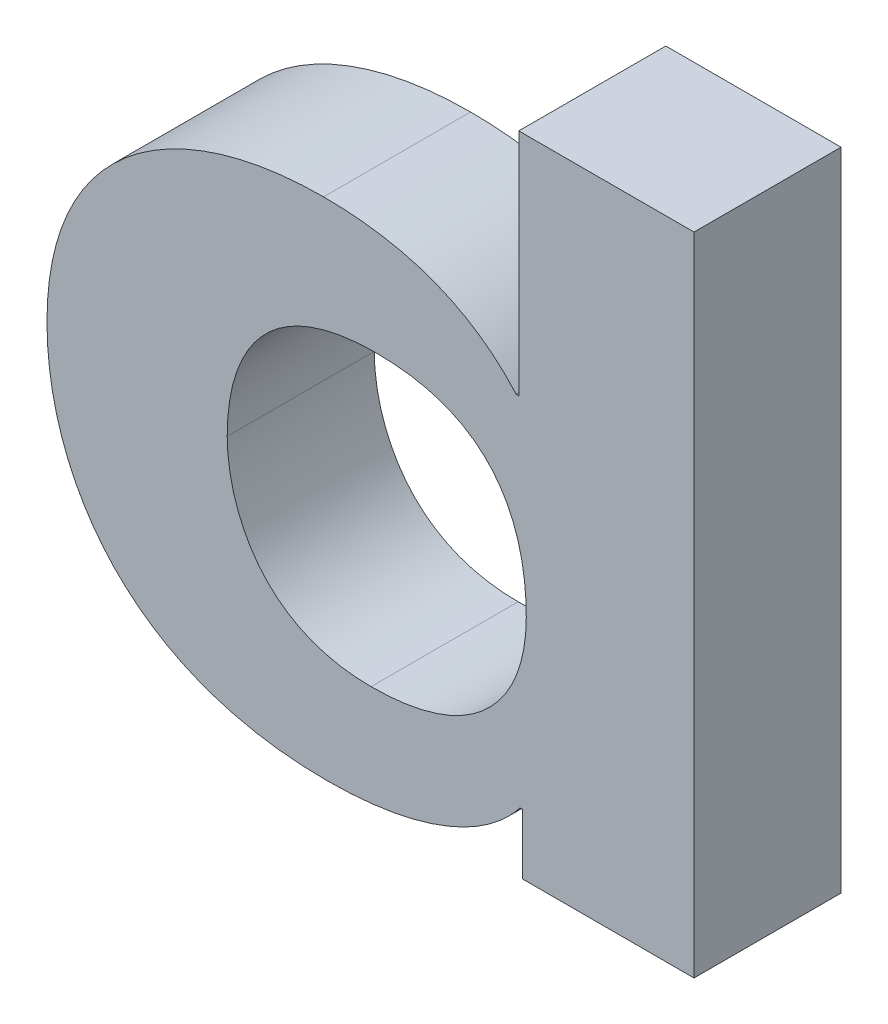
ISO-10303-21;
HEADER;
FILE_DESCRIPTION(('STEP AP214'),'2;1');
FILE_NAME('part.step','',(''),(''),'','','');
FILE_SCHEMA(('AUTOMOTIVE_DESIGN { 1 0 10303 214 1 1 1 1 }'));
ENDSEC;
DATA;
#1=APPLICATION_CONTEXT('core data for automotive mechanical design processes');
#2=APPLICATION_PROTOCOL_DEFINITION('international standard','automotive_design',2000,#1);
#3=PRODUCT_CONTEXT('',#1,'mechanical');
#4=PRODUCT('Part','Part','',(#3));
#5=PRODUCT_RELATED_PRODUCT_CATEGORY('part','',(#4));
#6=PRODUCT_DEFINITION_FORMATION('','',#4);
#7=PRODUCT_DEFINITION_CONTEXT('part definition',#1,'design');
#8=PRODUCT_DEFINITION('design','',#6,#7);
#9=PRODUCT_DEFINITION_SHAPE('','',#8);
#10=(LENGTH_UNIT() NAMED_UNIT(*) SI_UNIT(.MILLI.,.METRE.));
#11=(NAMED_UNIT(*) PLANE_ANGLE_UNIT() SI_UNIT($,.RADIAN.));
#12=(NAMED_UNIT(*) SI_UNIT($,.STERADIAN.) SOLID_ANGLE_UNIT());
#13=UNCERTAINTY_MEASURE_WITH_UNIT(LENGTH_MEASURE(1.E-05),#10,'distance_accuracy_value','');
#14=(GEOMETRIC_REPRESENTATION_CONTEXT(3) GLOBAL_UNCERTAINTY_ASSIGNED_CONTEXT((#13)) GLOBAL_UNIT_ASSIGNED_CONTEXT((#10,
#11,#12)) REPRESENTATION_CONTEXT('',''));
#15=CARTESIAN_POINT('',(0.,0.,0.));
#16=DIRECTION('',(0.,0.,1.));
#17=DIRECTION('',(1.,0.,0.));
#18=AXIS2_PLACEMENT_3D('',#15,#16,#17);
#19=CARTESIAN_POINT('',(14.48304104192,-0.146071150301,-5.499));
#20=CARTESIAN_POINT('',(14.48304104192,-0.146071150301,-6.501));
#21=CARTESIAN_POINT('',(15.30018444192,-0.146071150301,-5.499));
#22=CARTESIAN_POINT('',(15.30018444192,-0.146071150301,-6.501));
#23=CARTESIAN_POINT('',(15.50452461969,-0.67247203919,-5.499));
#24=CARTESIAN_POINT('',(15.50452461969,-0.67247203919,-6.501));
#25=CARTESIAN_POINT('',(15.50452461969,-1.192661216968,-5.499));
#26=CARTESIAN_POINT('',(15.50452461969,-1.192661216968,-6.501));
#27=(BOUNDED_SURFACE() B_SPLINE_SURFACE(3,1,((#19,#20),(#21,#22),(#23,#24),(#25,#26)),
.UNSPECIFIED.,.F.,.F.,.F.) B_SPLINE_SURFACE_WITH_KNOTS((4,4),(2,2),(0.,1.),(-1.001,0.001),
.UNSPECIFIED.) GEOMETRIC_REPRESENTATION_ITEM() RATIONAL_B_SPLINE_SURFACE(((1.,1.),(1.,1.),(1.,
1.),(1.,1.))) REPRESENTATION_ITEM('') SURFACE());
#28=DIRECTION('',(0.,0.,1.));
#29=VECTOR('',#28,1.);
#30=CARTESIAN_POINT('',(14.48304104192,-0.146071150301,-6.5));
#31=LINE('',#30,#29);
#32=CARTESIAN_POINT('',(14.48304104192,-0.146071150301,-6.5));
#33=VERTEX_POINT('',#32);
#34=CARTESIAN_POINT('',(14.48304104192,-0.146071150301,-5.5));
#35=VERTEX_POINT('',#34);
#36=EDGE_CURVE('E205',#33,#35,#31,.T.);
#37=CARTESIAN_POINT('',(14.48304104192,-0.146071150301,-6.5));
#38=CARTESIAN_POINT('',(15.30018444192,-0.146071150301,-6.5));
#39=CARTESIAN_POINT('',(15.50452461969,-0.67247203919,-6.5));
#40=CARTESIAN_POINT('',(15.50452461969,-1.192661216968,-6.5));
#41=(BOUNDED_CURVE() B_SPLINE_CURVE(3,(#37,#38,#39,#40),.UNSPECIFIED.,.F.,
.F.) B_SPLINE_CURVE_WITH_KNOTS((4,4),(0.,1.),
.UNSPECIFIED.) CURVE() GEOMETRIC_REPRESENTATION_ITEM() RATIONAL_B_SPLINE_CURVE((1.,1.,1.,1.)) REPRESENTATION_ITEM(''));
#42=CARTESIAN_POINT('',(15.50452461969,-1.192661216968,-6.5));
#43=VERTEX_POINT('',#42);
#44=EDGE_CURVE('E367',#33,#43,#41,.T.);
#45=DIRECTION('',(0.,0.,1.));
#46=VECTOR('',#45,1.);
#47=CARTESIAN_POINT('',(15.50452461969,-1.192661216968,-6.5));
#48=LINE('',#47,#46);
#49=CARTESIAN_POINT('',(15.50452461969,-1.192661216968,-5.5));
#50=VERTEX_POINT('',#49);
#51=EDGE_CURVE('E10',#43,#50,#48,.T.);
#52=CARTESIAN_POINT('',(14.48304104192,-0.146071150301,-5.5));
#53=CARTESIAN_POINT('',(15.30018444192,-0.146071150301,-5.5));
#54=CARTESIAN_POINT('',(15.50452461969,-0.67247203919,-5.5));
#55=CARTESIAN_POINT('',(15.50452461969,-1.192661216968,-5.5));
#56=(BOUNDED_CURVE() B_SPLINE_CURVE(3,(#52,#53,#54,#55),.UNSPECIFIED.,.F.,
.F.) B_SPLINE_CURVE_WITH_KNOTS((4,4),(0.,1.),
.UNSPECIFIED.) CURVE() GEOMETRIC_REPRESENTATION_ITEM() RATIONAL_B_SPLINE_CURVE((1.,1.,1.,1.)) REPRESENTATION_ITEM(''));
#57=EDGE_CURVE('E248',#35,#50,#56,.T.);
#58=ORIENTED_EDGE('',*,*,#36,.F.);
#59=ORIENTED_EDGE('',*,*,#44,.T.);
#60=ORIENTED_EDGE('',*,*,#51,.T.);
#61=ORIENTED_EDGE('',*,*,#57,.F.);
#62=EDGE_LOOP('',(#58,#59,#60,#61));
#63=FACE_BOUND('',#62,.T.);
#64=ADVANCED_FACE('F15',(#63),#27,.F.);
#65=CARTESIAN_POINT('',(15.50452461969,-1.192661216968,-5.499));
#66=CARTESIAN_POINT('',(15.50452461969,-1.192661216968,-6.501));
#67=CARTESIAN_POINT('',(15.50452461969,-1.676390105857,-5.499));
#68=CARTESIAN_POINT('',(15.50452461969,-1.676390105857,-6.501));
#69=CARTESIAN_POINT('',(15.20666164192,-2.12918743919,-5.499));
#70=CARTESIAN_POINT('',(15.20666164192,-2.12918743919,-6.501));
#71=CARTESIAN_POINT('',(14.44897117525,-2.12918743919,-5.499));
#72=CARTESIAN_POINT('',(14.44897117525,-2.12918743919,-6.501));
#73=(BOUNDED_SURFACE() B_SPLINE_SURFACE(3,1,((#65,#66),(#67,#68),(#69,#70),(#71,#72)),
.UNSPECIFIED.,.F.,.F.,.F.) B_SPLINE_SURFACE_WITH_KNOTS((4,4),(2,2),(0.,1.),(-1.001,
0.00100000000000067),
.UNSPECIFIED.) GEOMETRIC_REPRESENTATION_ITEM() RATIONAL_B_SPLINE_SURFACE(((1.,1.),(1.,1.),(1.,
1.),(1.,1.))) REPRESENTATION_ITEM('') SURFACE());
#74=CARTESIAN_POINT('',(15.50452461969,-1.192661216968,-6.5));
#75=CARTESIAN_POINT('',(15.50452461969,-1.676390105857,-6.5));
#76=CARTESIAN_POINT('',(15.20666164192,-2.12918743919,-6.5));
#77=CARTESIAN_POINT('',(14.44897117525,-2.12918743919,-6.5));
#78=(BOUNDED_CURVE() B_SPLINE_CURVE(3,(#74,#75,#76,#77),.UNSPECIFIED.,.F.,
.F.) B_SPLINE_CURVE_WITH_KNOTS((4,4),(0.,1.),
.UNSPECIFIED.) CURVE() GEOMETRIC_REPRESENTATION_ITEM() RATIONAL_B_SPLINE_CURVE((1.,1.,1.,1.)) REPRESENTATION_ITEM(''));
#79=CARTESIAN_POINT('',(14.44897117525,-2.12918743919,-6.5));
#80=VERTEX_POINT('',#79);
#81=EDGE_CURVE('E377',#43,#80,#78,.T.);
#82=DIRECTION('',(0.,0.,1.));
#83=VECTOR('',#82,1.);
#84=CARTESIAN_POINT('',(14.44897117525,-2.12918743919,-6.5));
#85=LINE('',#84,#83);
#86=CARTESIAN_POINT('',(14.44897117525,-2.12918743919,-5.5));
#87=VERTEX_POINT('',#86);
#88=EDGE_CURVE('E30',#80,#87,#85,.T.);
#89=CARTESIAN_POINT('',(15.50452461969,-1.192661216968,-5.5));
#90=CARTESIAN_POINT('',(15.50452461969,-1.676390105857,-5.5));
#91=CARTESIAN_POINT('',(15.20666164192,-2.12918743919,-5.5));
#92=CARTESIAN_POINT('',(14.44897117525,-2.12918743919,-5.5));
#93=(BOUNDED_CURVE() B_SPLINE_CURVE(3,(#89,#90,#91,#92),.UNSPECIFIED.,.F.,
.F.) B_SPLINE_CURVE_WITH_KNOTS((4,4),(0.,1.),
.UNSPECIFIED.) CURVE() GEOMETRIC_REPRESENTATION_ITEM() RATIONAL_B_SPLINE_CURVE((1.,1.,1.,1.)) REPRESENTATION_ITEM(''));
#94=EDGE_CURVE('E272',#50,#87,#93,.T.);
#95=ORIENTED_EDGE('',*,*,#51,.F.);
#96=ORIENTED_EDGE('',*,*,#81,.T.);
#97=ORIENTED_EDGE('',*,*,#88,.T.);
#98=ORIENTED_EDGE('',*,*,#94,.F.);
#99=EDGE_LOOP('',(#95,#96,#97,#98));
#100=FACE_BOUND('',#99,.T.);
#101=ADVANCED_FACE('F416',(#100),#73,.F.);
#102=CARTESIAN_POINT('',(14.44897117525,-2.12918743919,-5.499));
#103=CARTESIAN_POINT('',(14.44897117525,-2.12918743919,-6.501));
#104=CARTESIAN_POINT('',(13.68291846414,-2.12918743919,-5.499));
#105=CARTESIAN_POINT('',(13.68291846414,-2.12918743919,-6.501));
#106=CARTESIAN_POINT('',(13.47004106414,-1.529349505857,-5.499));
#107=CARTESIAN_POINT('',(13.47004106414,-1.529349505857,-6.501));
#108=CARTESIAN_POINT('',(13.47004106414,-1.143701305857,-5.499));
#109=CARTESIAN_POINT('',(13.47004106414,-1.143701305857,-6.501));
#110=(BOUNDED_SURFACE() B_SPLINE_SURFACE(3,1,((#102,#103),(#104,#105),(#106,#107),(#108,#109)),
.UNSPECIFIED.,.F.,.F.,.F.) B_SPLINE_SURFACE_WITH_KNOTS((4,4),(2,2),(0.,1.),(-1.001,0.001),
.UNSPECIFIED.) GEOMETRIC_REPRESENTATION_ITEM() RATIONAL_B_SPLINE_SURFACE(((1.,1.),(1.,1.),(1.,
1.),(1.,1.))) REPRESENTATION_ITEM('') SURFACE());
#111=CARTESIAN_POINT('',(14.44897117525,-2.12918743919,-6.5));
#112=CARTESIAN_POINT('',(13.68291846414,-2.12918743919,-6.5));
#113=CARTESIAN_POINT('',(13.47004106414,-1.529349505857,-6.5));
#114=CARTESIAN_POINT('',(13.47004106414,-1.143701305857,-6.5));
#115=(BOUNDED_CURVE() B_SPLINE_CURVE(3,(#111,#112,#113,#114),.UNSPECIFIED.,.F.,
.F.) B_SPLINE_CURVE_WITH_KNOTS((4,4),(0.,1.),
.UNSPECIFIED.) CURVE() GEOMETRIC_REPRESENTATION_ITEM() RATIONAL_B_SPLINE_CURVE((1.,1.,1.,1.)) REPRESENTATION_ITEM(''));
#116=CARTESIAN_POINT('',(13.47004106414,-1.143701305857,-6.5));
#117=VERTEX_POINT('',#116);
#118=EDGE_CURVE('E315',#80,#117,#115,.T.);
#119=DIRECTION('',(0.,0.,1.));
#120=VECTOR('',#119,1.);
#121=CARTESIAN_POINT('',(13.47004106414,-1.143701305857,-6.5));
#122=LINE('',#121,#120);
#123=CARTESIAN_POINT('',(13.47004106414,-1.143701305857,-5.5));
#124=VERTEX_POINT('',#123);
#125=EDGE_CURVE('E208',#117,#124,#122,.T.);
#126=CARTESIAN_POINT('',(14.44897117525,-2.12918743919,-5.5));
#127=CARTESIAN_POINT('',(13.68291846414,-2.12918743919,-5.5));
#128=CARTESIAN_POINT('',(13.47004106414,-1.529349505857,-5.5));
#129=CARTESIAN_POINT('',(13.47004106414,-1.143701305857,-5.5));
#130=(BOUNDED_CURVE() B_SPLINE_CURVE(3,(#126,#127,#128,#129),.UNSPECIFIED.,.F.,
.F.) B_SPLINE_CURVE_WITH_KNOTS((4,4),(0.,1.),
.UNSPECIFIED.) CURVE() GEOMETRIC_REPRESENTATION_ITEM() RATIONAL_B_SPLINE_CURVE((1.,1.,1.,1.)) REPRESENTATION_ITEM(''));
#131=EDGE_CURVE('E256',#87,#124,#130,.T.);
#132=ORIENTED_EDGE('',*,*,#88,.F.);
#133=ORIENTED_EDGE('',*,*,#118,.T.);
#134=ORIENTED_EDGE('',*,*,#125,.T.);
#135=ORIENTED_EDGE('',*,*,#131,.F.);
#136=EDGE_LOOP('',(#132,#133,#134,#135));
#137=FACE_BOUND('',#136,.T.);
#138=ADVANCED_FACE('F422',(#137),#110,.F.);
#139=CARTESIAN_POINT('',(13.47004106414,-1.143701305857,-5.499));
#140=CARTESIAN_POINT('',(13.47004106414,-1.143701305857,-6.501));
#141=CARTESIAN_POINT('',(13.47003824192,-0.629438794746,-5.499));
#142=CARTESIAN_POINT('',(13.47003824192,-0.629438794746,-6.501));
#143=CARTESIAN_POINT('',(13.72540419747,-0.146071150301,-5.499));
#144=CARTESIAN_POINT('',(13.72540419747,-0.146071150301,-6.501));
#145=CARTESIAN_POINT('',(14.48304104192,-0.146071150301,-5.499));
#146=CARTESIAN_POINT('',(14.48304104192,-0.146071150301,-6.501));
#147=(BOUNDED_SURFACE() B_SPLINE_SURFACE(3,1,((#139,#140),(#141,#142),(#143,#144),(#145,#146)),
.UNSPECIFIED.,.F.,.F.,.F.) B_SPLINE_SURFACE_WITH_KNOTS((4,4),(2,2),(0.,1.),(-1.001,0.001),
.UNSPECIFIED.) GEOMETRIC_REPRESENTATION_ITEM() RATIONAL_B_SPLINE_SURFACE(((1.,1.),(1.,1.),(1.,
1.),(1.,1.))) REPRESENTATION_ITEM('') SURFACE());
#148=CARTESIAN_POINT('',(13.47004106414,-1.143701305857,-6.5));
#149=CARTESIAN_POINT('',(13.47003824192,-0.629438794746,-6.5));
#150=CARTESIAN_POINT('',(13.72540419747,-0.146071150301,-6.5));
#151=CARTESIAN_POINT('',(14.48304104192,-0.146071150301,-6.5));
#152=(BOUNDED_CURVE() B_SPLINE_CURVE(3,(#148,#149,#150,#151),.UNSPECIFIED.,.F.,
.F.) B_SPLINE_CURVE_WITH_KNOTS((4,4),(0.,1.),
.UNSPECIFIED.) CURVE() GEOMETRIC_REPRESENTATION_ITEM() RATIONAL_B_SPLINE_CURVE((1.,1.,1.,1.)) REPRESENTATION_ITEM(''));
#153=EDGE_CURVE('E218',#117,#33,#152,.T.);
#154=CARTESIAN_POINT('',(13.47004106414,-1.143701305857,-5.5));
#155=CARTESIAN_POINT('',(13.47003824192,-0.629438794746,-5.5));
#156=CARTESIAN_POINT('',(13.72540419747,-0.146071150301,-5.5));
#157=CARTESIAN_POINT('',(14.48304104192,-0.146071150301,-5.5));
#158=(BOUNDED_CURVE() B_SPLINE_CURVE(3,(#154,#155,#156,#157),.UNSPECIFIED.,.F.,
.F.) B_SPLINE_CURVE_WITH_KNOTS((4,4),(0.,1.),
.UNSPECIFIED.) CURVE() GEOMETRIC_REPRESENTATION_ITEM() RATIONAL_B_SPLINE_CURVE((1.,1.,1.,1.)) REPRESENTATION_ITEM(''));
#159=EDGE_CURVE('E240',#124,#35,#158,.T.);
#160=ORIENTED_EDGE('',*,*,#125,.F.);
#161=ORIENTED_EDGE('',*,*,#153,.T.);
#162=ORIENTED_EDGE('',*,*,#36,.T.);
#163=ORIENTED_EDGE('',*,*,#159,.F.);
#164=EDGE_LOOP('',(#160,#161,#162,#163));
#165=FACE_BOUND('',#164,.T.);
#166=ADVANCED_FACE('F439',(#165),#147,.F.);
#167=CARTESIAN_POINT('',(15.47052248636,-2.337185216968,-5.49));
#168=DIRECTION('',(0.,1.,0.));
#169=DIRECTION('',(-1.,0.,0.));
#170=AXIS2_PLACEMENT_3D('',#167,#168,#169);
#171=PLANE('',#170);
#172=DIRECTION('',(0.,0.,1.));
#173=VECTOR('',#172,1.);
#174=CARTESIAN_POINT('',(15.46203888636,-2.337185216968,-6.5));
#175=LINE('',#174,#173);
#176=CARTESIAN_POINT('',(15.46203888636,-2.337185216968,-6.5));
#177=VERTEX_POINT('',#176);
#178=CARTESIAN_POINT('',(15.46203888636,-2.337185216968,-5.5));
#179=VERTEX_POINT('',#178);
#180=EDGE_CURVE('E211',#177,#179,#175,.T.);
#181=ORIENTED_EDGE('',*,*,#180,.F.);
#182=DIRECTION('',(1.,0.,0.));
#183=VECTOR('',#182,1.);
#184=CARTESIAN_POINT('',(15.46203888636,-2.337185216968,-6.5));
#185=LINE('',#184,#183);
#186=CARTESIAN_POINT('',(15.47900608636,-2.337185216968,-6.5));
#187=VERTEX_POINT('',#186);
#188=EDGE_CURVE('E197',#177,#187,#185,.T.);
#189=ORIENTED_EDGE('',*,*,#188,.T.);
#190=DIRECTION('',(0.,0.,1.));
#191=VECTOR('',#190,1.);
#192=CARTESIAN_POINT('',(15.47900608636,-2.337185216968,-6.5));
#193=LINE('',#192,#191);
#194=CARTESIAN_POINT('',(15.47900608636,-2.337185216968,-5.5));
#195=VERTEX_POINT('',#194);
#196=EDGE_CURVE('E291',#187,#195,#193,.T.);
#197=ORIENTED_EDGE('',*,*,#196,.T.);
#198=DIRECTION('',(1.,0.,0.));
#199=VECTOR('',#198,1.);
#200=CARTESIAN_POINT('',(15.46203888636,-2.337185216968,-5.5));
#201=LINE('',#200,#199);
#202=EDGE_CURVE('E227',#179,#195,#201,.T.);
#203=ORIENTED_EDGE('',*,*,#202,.F.);
#204=EDGE_LOOP('',(#181,#189,#197,#203));
#205=FACE_BOUND('',#204,.T.);
#206=ADVANCED_FACE('F330',(#205),#171,.F.);
#207=CARTESIAN_POINT('',(15.47900608636,-2.5422097836345,-5.49));
#208=DIRECTION('',(1.,0.,0.));
#209=DIRECTION('',(0.,0.,-1.));
#210=AXIS2_PLACEMENT_3D('',#207,#208,#209);
#211=PLANE('',#210);
#212=ORIENTED_EDGE('',*,*,#196,.F.);
#213=DIRECTION('',(0.,-1.,0.));
#214=VECTOR('',#213,1.);
#215=CARTESIAN_POINT('',(15.47900608636,-2.337185216968,-6.5));
#216=LINE('',#215,#214);
#217=CARTESIAN_POINT('',(15.47900608636,-2.747234350301,-6.5));
#218=VERTEX_POINT('',#217);
#219=EDGE_CURVE('E195',#187,#218,#216,.T.);
#220=ORIENTED_EDGE('',*,*,#219,.T.);
#221=DIRECTION('',(0.,0.,1.));
#222=VECTOR('',#221,1.);
#223=CARTESIAN_POINT('',(15.47900608636,-2.747234350301,-6.5));
#224=LINE('',#223,#222);
#225=CARTESIAN_POINT('',(15.47900608636,-2.747234350301,-5.5));
#226=VERTEX_POINT('',#225);
#227=EDGE_CURVE('E203',#218,#226,#224,.T.);
#228=ORIENTED_EDGE('',*,*,#227,.T.);
#229=DIRECTION('',(0.,-1.,0.));
#230=VECTOR('',#229,1.);
#231=CARTESIAN_POINT('',(15.47900608636,-2.337185216968,-5.5));
#232=LINE('',#231,#230);
#233=EDGE_CURVE('E219',#195,#226,#232,.T.);
#234=ORIENTED_EDGE('',*,*,#233,.F.);
#235=EDGE_LOOP('',(#212,#220,#228,#234));
#236=FACE_BOUND('',#235,.T.);
#237=ADVANCED_FACE('F337',(#236),#211,.F.);
#238=CARTESIAN_POINT('',(14.15105175303,-2.832880328079,-5.499));
#239=CARTESIAN_POINT('',(14.15105175303,-2.832880328079,-6.501));
#240=CARTESIAN_POINT('',(14.64488137525,-2.832880328079,-5.499));
#241=CARTESIAN_POINT('',(14.64488137525,-2.832880328079,-6.501));
#242=CARTESIAN_POINT('',(15.17259177525,-2.704336572523,-5.499));
#243=CARTESIAN_POINT('',(15.17259177525,-2.704336572523,-6.501));
#244=CARTESIAN_POINT('',(15.46203888636,-2.337185216968,-5.499));
#245=CARTESIAN_POINT('',(15.46203888636,-2.337185216968,-6.501));
#246=(BOUNDED_SURFACE() B_SPLINE_SURFACE(3,1,((#238,#239),(#240,#241),(#242,#243),(#244,#245)),
.UNSPECIFIED.,.F.,.F.,.F.) B_SPLINE_SURFACE_WITH_KNOTS((4,4),(2,2),(0.,1.),(-1.001,0.001),
.UNSPECIFIED.) GEOMETRIC_REPRESENTATION_ITEM() RATIONAL_B_SPLINE_SURFACE(((1.,1.),(1.,1.),(1.,
1.),(1.,1.))) REPRESENTATION_ITEM('') SURFACE());
#247=DIRECTION('',(0.,0.,1.));
#248=VECTOR('',#247,1.);
#249=CARTESIAN_POINT('',(14.15105175303,-2.832880328079,-6.5));
#250=LINE('',#249,#248);
#251=CARTESIAN_POINT('',(14.15105175303,-2.832880328079,-6.5));
#252=VERTEX_POINT('',#251);
#253=CARTESIAN_POINT('',(14.15105175303,-2.832880328079,-5.5));
#254=VERTEX_POINT('',#253);
#255=EDGE_CURVE('E200',#252,#254,#250,.T.);
#256=CARTESIAN_POINT('',(14.15105175303,-2.832880328079,-6.5));
#257=CARTESIAN_POINT('',(14.64488137525,-2.832880328079,-6.5));
#258=CARTESIAN_POINT('',(15.17259177525,-2.704336572523,-6.5));
#259=CARTESIAN_POINT('',(15.46203888636,-2.337185216968,-6.5));
#260=(BOUNDED_CURVE() B_SPLINE_CURVE(3,(#256,#257,#258,#259),.UNSPECIFIED.,.F.,
.F.) B_SPLINE_CURVE_WITH_KNOTS((4,4),(0.,1.),
.UNSPECIFIED.) CURVE() GEOMETRIC_REPRESENTATION_ITEM() RATIONAL_B_SPLINE_CURVE((1.,1.,1.,1.)) REPRESENTATION_ITEM(''));
#261=EDGE_CURVE('E385',#252,#177,#260,.T.);
#262=CARTESIAN_POINT('',(14.15105175303,-2.832880328079,-5.5));
#263=CARTESIAN_POINT('',(14.64488137525,-2.832880328079,-5.5));
#264=CARTESIAN_POINT('',(15.17259177525,-2.704336572523,-5.5));
#265=CARTESIAN_POINT('',(15.46203888636,-2.337185216968,-5.5));
#266=(BOUNDED_CURVE() B_SPLINE_CURVE(3,(#262,#263,#264,#265),.UNSPECIFIED.,.F.,
.F.) B_SPLINE_CURVE_WITH_KNOTS((4,4),(0.,1.),
.UNSPECIFIED.) CURVE() GEOMETRIC_REPRESENTATION_ITEM() RATIONAL_B_SPLINE_CURVE((1.,1.,1.,1.)) REPRESENTATION_ITEM(''));
#267=EDGE_CURVE('E257',#254,#179,#266,.T.);
#268=ORIENTED_EDGE('',*,*,#255,.F.);
#269=ORIENTED_EDGE('',*,*,#261,.T.);
#270=ORIENTED_EDGE('',*,*,#180,.T.);
#271=ORIENTED_EDGE('',*,*,#267,.F.);
#272=EDGE_LOOP('',(#268,#269,#270,#271));
#273=FACE_BOUND('',#272,.T.);
#274=ADVANCED_FACE('F428',(#273),#246,.F.);
#275=CARTESIAN_POINT('',(16.062185853025,-2.747234350301,-5.49));
#276=DIRECTION('',(0.,1.,0.));
#277=DIRECTION('',(-1.,0.,0.));
#278=AXIS2_PLACEMENT_3D('',#275,#276,#277);
#279=PLANE('',#278);
#280=ORIENTED_EDGE('',*,*,#227,.F.);
#281=DIRECTION('',(1.,0.,0.));
#282=VECTOR('',#281,1.);
#283=CARTESIAN_POINT('',(15.47900608636,-2.747234350301,-6.5));
#284=LINE('',#283,#282);
#285=CARTESIAN_POINT('',(16.64536561969,-2.747234350301,-6.5));
#286=VERTEX_POINT('',#285);
#287=EDGE_CURVE('E198',#218,#286,#284,.T.);
#288=ORIENTED_EDGE('',*,*,#287,.T.);
#289=DIRECTION('',(0.,0.,1.));
#290=VECTOR('',#289,1.);
#291=CARTESIAN_POINT('',(16.64536561969,-2.747234350301,-6.5));
#292=LINE('',#291,#290);
#293=CARTESIAN_POINT('',(16.64536561969,-2.747234350301,-5.5));
#294=VERTEX_POINT('',#293);
#295=EDGE_CURVE('E204',#286,#294,#292,.T.);
#296=ORIENTED_EDGE('',*,*,#295,.T.);
#297=DIRECTION('',(1.,0.,0.));
#298=VECTOR('',#297,1.);
#299=CARTESIAN_POINT('',(15.47900608636,-2.747234350301,-5.5));
#300=LINE('',#299,#298);
#301=EDGE_CURVE('E226',#226,#294,#300,.T.);
#302=ORIENTED_EDGE('',*,*,#301,.F.);
#303=EDGE_LOOP('',(#280,#288,#296,#302));
#304=FACE_BOUND('',#303,.T.);
#305=ADVANCED_FACE('F343',(#304),#279,.F.);
#306=CARTESIAN_POINT('',(12.24421448636,-1.082749772523,-5.499));
#307=CARTESIAN_POINT('',(12.24421448636,-1.082749772523,-6.501));
#308=CARTESIAN_POINT('',(12.24421448636,-1.976090350301,-5.499));
#309=CARTESIAN_POINT('',(12.24421448636,-1.976090350301,-6.501));
#310=CARTESIAN_POINT('',(12.80599475303,-2.832880328079,-5.499));
#311=CARTESIAN_POINT('',(12.80599475303,-2.832880328079,-6.501));
#312=CARTESIAN_POINT('',(14.15105175303,-2.832880328079,-5.499));
#313=CARTESIAN_POINT('',(14.15105175303,-2.832880328079,-6.501));
#314=(BOUNDED_SURFACE() B_SPLINE_SURFACE(3,1,((#306,#307),(#308,#309),(#310,#311),(#312,#313)),
.UNSPECIFIED.,.F.,.F.,.F.) B_SPLINE_SURFACE_WITH_KNOTS((4,4),(2,2),(0.,1.),(-1.001,0.001),
.UNSPECIFIED.) GEOMETRIC_REPRESENTATION_ITEM() RATIONAL_B_SPLINE_SURFACE(((1.,1.),(1.,1.),(1.,
1.),(1.,1.))) REPRESENTATION_ITEM('') SURFACE());
#315=DIRECTION('',(0.,0.,1.));
#316=VECTOR('',#315,1.);
#317=CARTESIAN_POINT('',(12.24421448636,-1.082749772523,-6.5));
#318=LINE('',#317,#316);
#319=CARTESIAN_POINT('',(12.24421448636,-1.082749772523,-6.5));
#320=VERTEX_POINT('',#319);
#321=CARTESIAN_POINT('',(12.24421448636,-1.082749772523,-5.5));
#322=VERTEX_POINT('',#321);
#323=EDGE_CURVE('E255',#320,#322,#318,.T.);
#324=CARTESIAN_POINT('',(12.24421448636,-1.082749772523,-6.5));
#325=CARTESIAN_POINT('',(12.24421448636,-1.976090350301,-6.5));
#326=CARTESIAN_POINT('',(12.80599475303,-2.832880328079,-6.5));
#327=CARTESIAN_POINT('',(14.15105175303,-2.832880328079,-6.5));
#328=(BOUNDED_CURVE() B_SPLINE_CURVE(3,(#324,#325,#326,#327),.UNSPECIFIED.,.F.,
.F.) B_SPLINE_CURVE_WITH_KNOTS((4,4),(0.,1.),
.UNSPECIFIED.) CURVE() GEOMETRIC_REPRESENTATION_ITEM() RATIONAL_B_SPLINE_CURVE((1.,1.,1.,1.)) REPRESENTATION_ITEM(''));
#329=EDGE_CURVE('E21',#320,#252,#328,.T.);
#330=CARTESIAN_POINT('',(12.24421448636,-1.082749772523,-5.5));
#331=CARTESIAN_POINT('',(12.24421448636,-1.976090350301,-5.5));
#332=CARTESIAN_POINT('',(12.80599475303,-2.832880328079,-5.5));
#333=CARTESIAN_POINT('',(14.15105175303,-2.832880328079,-5.5));
#334=(BOUNDED_CURVE() B_SPLINE_CURVE(3,(#330,#331,#332,#333),.UNSPECIFIED.,.F.,
.F.) B_SPLINE_CURVE_WITH_KNOTS((4,4),(0.,1.),
.UNSPECIFIED.) CURVE() GEOMETRIC_REPRESENTATION_ITEM() RATIONAL_B_SPLINE_CURVE((1.,1.,1.,1.)) REPRESENTATION_ITEM(''));
#335=EDGE_CURVE('E263',#322,#254,#334,.T.);
#336=ORIENTED_EDGE('',*,*,#323,.F.);
#337=ORIENTED_EDGE('',*,*,#329,.T.);
#338=ORIENTED_EDGE('',*,*,#255,.T.);
#339=ORIENTED_EDGE('',*,*,#335,.F.);
#340=EDGE_LOOP('',(#336,#337,#338,#339));
#341=FACE_BOUND('',#340,.T.);
#342=ADVANCED_FACE('F466',(#341),#314,.F.);
#343=CARTESIAN_POINT('',(16.64536561969,-0.5501385836345,-5.49));
#344=DIRECTION('',(-1.,0.,0.));
#345=DIRECTION('',(0.,1.,0.));
#346=AXIS2_PLACEMENT_3D('',#343,#344,#345);
#347=PLANE('',#346);
#348=ORIENTED_EDGE('',*,*,#295,.F.);
#349=DIRECTION('',(0.,1.,0.));
#350=VECTOR('',#349,1.);
#351=CARTESIAN_POINT('',(16.64536561969,-2.747234350301,-6.5));
#352=LINE('',#351,#350);
#353=CARTESIAN_POINT('',(16.64536561969,1.646957183032,-6.5));
#354=VERTEX_POINT('',#353);
#355=EDGE_CURVE('E233',#286,#354,#352,.T.);
#356=ORIENTED_EDGE('',*,*,#355,.T.);
#357=DIRECTION('',(0.,0.,1.));
#358=VECTOR('',#357,1.);
#359=CARTESIAN_POINT('',(16.64536561969,1.646957183032,-6.5));
#360=LINE('',#359,#358);
#361=CARTESIAN_POINT('',(16.64536561969,1.646957183032,-5.5));
#362=VERTEX_POINT('',#361);
#363=EDGE_CURVE('E249',#354,#362,#360,.T.);
#364=ORIENTED_EDGE('',*,*,#363,.T.);
#365=DIRECTION('',(0.,1.,0.));
#366=VECTOR('',#365,1.);
#367=CARTESIAN_POINT('',(16.64536561969,-2.747234350301,-5.5));
#368=LINE('',#367,#366);
#369=EDGE_CURVE('E230',#294,#362,#368,.T.);
#370=ORIENTED_EDGE('',*,*,#369,.F.);
#371=EDGE_LOOP('',(#348,#356,#364,#370));
#372=FACE_BOUND('',#371,.T.);
#373=ADVANCED_FACE('F402',(#372),#347,.F.);
#374=CARTESIAN_POINT('',(14.12553321969,0.594307805254,-5.499));
#375=CARTESIAN_POINT('',(14.12553321969,0.594307805254,-6.501));
#376=CARTESIAN_POINT('',(13.12950044192,0.594307805254,-5.499));
#377=CARTESIAN_POINT('',(13.12950044192,0.594307805254,-6.501));
#378=CARTESIAN_POINT('',(12.24421448636,0.0434128496990001,-5.499));
#379=CARTESIAN_POINT('',(12.24421448636,0.0434128496990001,-6.501));
#380=CARTESIAN_POINT('',(12.24421448636,-1.082749772523,-5.499));
#381=CARTESIAN_POINT('',(12.24421448636,-1.082749772523,-6.501));
#382=(BOUNDED_SURFACE() B_SPLINE_SURFACE(3,1,((#374,#375),(#376,#377),(#378,#379),(#380,#381)),
.UNSPECIFIED.,.F.,.F.,.F.) B_SPLINE_SURFACE_WITH_KNOTS((4,4),(2,2),(0.,1.),(-1.001,0.001),
.UNSPECIFIED.) GEOMETRIC_REPRESENTATION_ITEM() RATIONAL_B_SPLINE_SURFACE(((1.,1.),(1.,1.),(1.,
1.),(1.,1.))) REPRESENTATION_ITEM('') SURFACE());
#383=DIRECTION('',(0.,0.,1.));
#384=VECTOR('',#383,1.);
#385=CARTESIAN_POINT('',(14.12553321969,0.594307805254,-6.5));
#386=LINE('',#385,#384);
#387=CARTESIAN_POINT('',(14.12553321969,0.594307805254,-6.5));
#388=VERTEX_POINT('',#387);
#389=CARTESIAN_POINT('',(14.12553321969,0.594307805254,-5.5));
#390=VERTEX_POINT('',#389);
#391=EDGE_CURVE('E273',#388,#390,#386,.T.);
#392=CARTESIAN_POINT('',(14.12553321969,0.594307805254,-6.5));
#393=CARTESIAN_POINT('',(13.12950044192,0.594307805254,-6.5));
#394=CARTESIAN_POINT('',(12.24421448636,0.0434128496990001,-6.5));
#395=CARTESIAN_POINT('',(12.24421448636,-1.082749772523,-6.5));
#396=(BOUNDED_CURVE() B_SPLINE_CURVE(3,(#392,#393,#394,#395),.UNSPECIFIED.,.F.,
.F.) B_SPLINE_CURVE_WITH_KNOTS((4,4),(0.,1.),
.UNSPECIFIED.) CURVE() GEOMETRIC_REPRESENTATION_ITEM() RATIONAL_B_SPLINE_CURVE((1.,1.,1.,1.)) REPRESENTATION_ITEM(''));
#397=EDGE_CURVE('E212',#388,#320,#396,.T.);
#398=CARTESIAN_POINT('',(14.12553321969,0.594307805254,-5.5));
#399=CARTESIAN_POINT('',(13.12950044192,0.594307805254,-5.5));
#400=CARTESIAN_POINT('',(12.24421448636,0.0434128496990001,-5.5));
#401=CARTESIAN_POINT('',(12.24421448636,-1.082749772523,-5.5));
#402=(BOUNDED_CURVE() B_SPLINE_CURVE(3,(#398,#399,#400,#401),.UNSPECIFIED.,.F.,
.F.) B_SPLINE_CURVE_WITH_KNOTS((4,4),(0.,1.),
.UNSPECIFIED.) CURVE() GEOMETRIC_REPRESENTATION_ITEM() RATIONAL_B_SPLINE_CURVE((1.,1.,1.,1.)) REPRESENTATION_ITEM(''));
#403=EDGE_CURVE('E363',#390,#322,#402,.T.);
#404=ORIENTED_EDGE('',*,*,#391,.F.);
#405=ORIENTED_EDGE('',*,*,#397,.T.);
#406=ORIENTED_EDGE('',*,*,#323,.T.);
#407=ORIENTED_EDGE('',*,*,#403,.F.);
#408=EDGE_LOOP('',(#404,#405,#406,#407));
#409=FACE_BOUND('',#408,.T.);
#410=ADVANCED_FACE('F17',(#409),#382,.F.);
#411=CARTESIAN_POINT('',(16.04942658636,1.646957183032,-5.49));
#412=DIRECTION('',(0.,-1.,0.));
#413=DIRECTION('',(0.,0.,1.));
#414=AXIS2_PLACEMENT_3D('',#411,#412,#413);
#415=PLANE('',#414);
#416=ORIENTED_EDGE('',*,*,#363,.F.);
#417=DIRECTION('',(-1.,0.,0.));
#418=VECTOR('',#417,1.);
#419=CARTESIAN_POINT('',(16.64536561969,1.646957183032,-6.5));
#420=LINE('',#419,#418);
#421=CARTESIAN_POINT('',(15.45348755303,1.646957183032,-6.5));
#422=VERTEX_POINT('',#421);
#423=EDGE_CURVE('E237',#354,#422,#420,.T.);
#424=ORIENTED_EDGE('',*,*,#423,.T.);
#425=DIRECTION('',(0.,0.,1.));
#426=VECTOR('',#425,1.);
#427=CARTESIAN_POINT('',(15.45348755303,1.646957183032,-6.5));
#428=LINE('',#427,#426);
#429=CARTESIAN_POINT('',(15.45348755303,1.646957183032,-5.5));
#430=VERTEX_POINT('',#429);
#431=EDGE_CURVE('E178',#422,#430,#428,.T.);
#432=ORIENTED_EDGE('',*,*,#431,.T.);
#433=DIRECTION('',(-1.,0.,0.));
#434=VECTOR('',#433,1.);
#435=CARTESIAN_POINT('',(16.64536561969,1.646957183032,-5.5));
#436=LINE('',#435,#434);
#437=EDGE_CURVE('E163',#362,#430,#436,.T.);
#438=ORIENTED_EDGE('',*,*,#437,.F.);
#439=EDGE_LOOP('',(#416,#424,#432,#438));
#440=FACE_BOUND('',#439,.T.);
#441=ADVANCED_FACE('F403',(#440),#415,.F.);
#442=CARTESIAN_POINT('',(14.79490695044,-0.772057199902,-5.5));
#443=DIRECTION('',(0.,0.,1.));
#444=DIRECTION('',(0.,-1.,0.));
#445=AXIS2_PLACEMENT_3D('',#442,#443,#444);
#446=PLANE('',#445);
#447=ORIENTED_EDGE('',*,*,#159,.T.);
#448=ORIENTED_EDGE('',*,*,#57,.T.);
#449=ORIENTED_EDGE('',*,*,#94,.T.);
#450=ORIENTED_EDGE('',*,*,#131,.T.);
#451=EDGE_LOOP('',(#447,#448,#449,#450));
#452=FACE_BOUND('',#451,.T.);
#453=DIRECTION('',(-1.,0.,0.));
#454=VECTOR('',#453,1.);
#455=CARTESIAN_POINT('',(15.45348755303,0.0863868274769999,-5.5));
#456=LINE('',#455,#454);
#457=CARTESIAN_POINT('',(15.45348755303,0.0863868274769999,-5.5));
#458=VERTEX_POINT('',#457);
#459=CARTESIAN_POINT('',(15.43638488636,0.0863868274769999,-5.5));
#460=VERTEX_POINT('',#459);
#461=EDGE_CURVE('E159',#458,#460,#456,.T.);
#462=ORIENTED_EDGE('',*,*,#461,.T.);
#463=CARTESIAN_POINT('',(15.43638488636,0.0863868274769999,-5.5));
#464=CARTESIAN_POINT('',(15.24914737525,0.294517249699,-5.5));
#465=CARTESIAN_POINT('',(14.89163955303,0.594307805254,-5.5));
#466=CARTESIAN_POINT('',(14.12553321969,0.594307805254,-5.5));
#467=(BOUNDED_CURVE() B_SPLINE_CURVE(3,(#463,#464,#465,#466),.UNSPECIFIED.,.F.,
.F.) B_SPLINE_CURVE_WITH_KNOTS((4,4),(0.,1.),
.UNSPECIFIED.) CURVE() GEOMETRIC_REPRESENTATION_ITEM() RATIONAL_B_SPLINE_CURVE((1.,1.,1.,1.)) REPRESENTATION_ITEM(''));
#468=EDGE_CURVE('E280',#460,#390,#467,.T.);
#469=ORIENTED_EDGE('',*,*,#468,.T.);
#470=ORIENTED_EDGE('',*,*,#403,.T.);
#471=ORIENTED_EDGE('',*,*,#335,.T.);
#472=ORIENTED_EDGE('',*,*,#267,.T.);
#473=ORIENTED_EDGE('',*,*,#202,.T.);
#474=ORIENTED_EDGE('',*,*,#233,.T.);
#475=ORIENTED_EDGE('',*,*,#301,.T.);
#476=ORIENTED_EDGE('',*,*,#369,.T.);
#477=ORIENTED_EDGE('',*,*,#437,.T.);
#478=DIRECTION('',(0.,-1.,0.));
#479=VECTOR('',#478,1.);
#480=CARTESIAN_POINT('',(15.45348755303,1.646957183032,-5.5));
#481=LINE('',#480,#479);
#482=EDGE_CURVE('E155',#430,#458,#481,.T.);
#483=ORIENTED_EDGE('',*,*,#482,.T.);
#484=EDGE_LOOP('',(#462,#469,#470,#471,#472,#473,#474,#475,#476,#477,#483));
#485=FACE_BOUND('',#484,.T.);
#486=ADVANCED_FACE('F157',(#452,#485),#446,.T.);
#487=CARTESIAN_POINT('',(14.79490695044,-0.772057199902,-6.5));
#488=DIRECTION('',(0.,0.,1.));
#489=DIRECTION('',(0.,-1.,0.));
#490=AXIS2_PLACEMENT_3D('',#487,#488,#489);
#491=PLANE('',#490);
#492=ORIENTED_EDGE('',*,*,#153,.F.);
#493=ORIENTED_EDGE('',*,*,#118,.F.);
#494=ORIENTED_EDGE('',*,*,#81,.F.);
#495=ORIENTED_EDGE('',*,*,#44,.F.);
#496=EDGE_LOOP('',(#492,#493,#494,#495));
#497=FACE_BOUND('',#496,.T.);
#498=DIRECTION('',(-1.,0.,0.));
#499=VECTOR('',#498,1.);
#500=CARTESIAN_POINT('',(15.45348755303,0.0863868274769999,-6.5));
#501=LINE('',#500,#499);
#502=CARTESIAN_POINT('',(15.45348755303,0.0863868274769999,-6.5));
#503=VERTEX_POINT('',#502);
#504=CARTESIAN_POINT('',(15.43638488636,0.0863868274769999,-6.5));
#505=VERTEX_POINT('',#504);
#506=EDGE_CURVE('E183',#503,#505,#501,.T.);
#507=ORIENTED_EDGE('',*,*,#506,.F.);
#508=DIRECTION('',(0.,-1.,0.));
#509=VECTOR('',#508,1.);
#510=CARTESIAN_POINT('',(15.45348755303,1.646957183032,-6.5));
#511=LINE('',#510,#509);
#512=EDGE_CURVE('E169',#422,#503,#511,.T.);
#513=ORIENTED_EDGE('',*,*,#512,.F.);
#514=ORIENTED_EDGE('',*,*,#423,.F.);
#515=ORIENTED_EDGE('',*,*,#355,.F.);
#516=ORIENTED_EDGE('',*,*,#287,.F.);
#517=ORIENTED_EDGE('',*,*,#219,.F.);
#518=ORIENTED_EDGE('',*,*,#188,.F.);
#519=ORIENTED_EDGE('',*,*,#261,.F.);
#520=ORIENTED_EDGE('',*,*,#329,.F.);
#521=ORIENTED_EDGE('',*,*,#397,.F.);
#522=CARTESIAN_POINT('',(15.43638488636,0.0863868274769999,-6.5));
#523=CARTESIAN_POINT('',(15.24914737525,0.294517249699,-6.5));
#524=CARTESIAN_POINT('',(14.89163955303,0.594307805254,-6.5));
#525=CARTESIAN_POINT('',(14.12553321969,0.594307805254,-6.5));
#526=(BOUNDED_CURVE() B_SPLINE_CURVE(3,(#522,#523,#524,#525),.UNSPECIFIED.,.F.,
.F.) B_SPLINE_CURVE_WITH_KNOTS((4,4),(0.,1.),
.UNSPECIFIED.) CURVE() GEOMETRIC_REPRESENTATION_ITEM() RATIONAL_B_SPLINE_CURVE((1.,1.,1.,1.)) REPRESENTATION_ITEM(''));
#527=EDGE_CURVE('E147',#505,#388,#526,.T.);
#528=ORIENTED_EDGE('',*,*,#527,.F.);
#529=EDGE_LOOP('',(#507,#513,#514,#515,#516,#517,#518,#519,#520,#521,#528));
#530=FACE_BOUND('',#529,.T.);
#531=ADVANCED_FACE('F400',(#497,#530),#491,.F.);
#532=CARTESIAN_POINT('',(15.43638488636,0.0863868274769999,-5.49880934275375));
#533=CARTESIAN_POINT('',(15.43638488636,0.0863868274769999,-6.50119065724625));
#534=CARTESIAN_POINT('',(15.24914737525,0.294517249699,-5.49880934275375));
#535=CARTESIAN_POINT('',(15.24914737525,0.294517249699,-6.50119065724625));
#536=CARTESIAN_POINT('',(14.89163955303,0.594307805254,-5.49880934275375));
#537=CARTESIAN_POINT('',(14.89163955303,0.594307805254,-6.50119065724625));
#538=CARTESIAN_POINT('',(14.12553321969,0.594307805254,-5.49880934275375));
#539=CARTESIAN_POINT('',(14.12553321969,0.594307805254,-6.50119065724625));
#540=(BOUNDED_SURFACE() B_SPLINE_SURFACE(3,1,((#532,#533),(#534,#535),(#536,#537),(#538,#539)),
.UNSPECIFIED.,.F.,.F.,.F.) B_SPLINE_SURFACE_WITH_KNOTS((4,4),(2,2),(0.,1.),(-1.00119065724625,
0.00119065724625087),
.UNSPECIFIED.) GEOMETRIC_REPRESENTATION_ITEM() RATIONAL_B_SPLINE_SURFACE(((1.,1.),(1.,1.),(1.,
1.),(1.,1.))) REPRESENTATION_ITEM('') SURFACE());
#541=DIRECTION('',(0.,0.,1.));
#542=VECTOR('',#541,1.);
#543=CARTESIAN_POINT('',(15.43638488636,0.0863868274769999,-6.5));
#544=LINE('',#543,#542);
#545=EDGE_CURVE('E176',#505,#460,#544,.T.);
#546=ORIENTED_EDGE('',*,*,#545,.F.);
#547=ORIENTED_EDGE('',*,*,#527,.T.);
#548=ORIENTED_EDGE('',*,*,#391,.T.);
#549=ORIENTED_EDGE('',*,*,#468,.F.);
#550=EDGE_LOOP('',(#546,#547,#548,#549));
#551=FACE_BOUND('',#550,.T.);
#552=ADVANCED_FACE('F499',(#551),#540,.F.);
#553=CARTESIAN_POINT('',(15.45348755303,0.8666720052545,-5.49));
#554=DIRECTION('',(1.,0.,0.));
#555=DIRECTION('',(0.,1.,0.));
#556=AXIS2_PLACEMENT_3D('',#553,#554,#555);
#557=PLANE('',#556);
#558=ORIENTED_EDGE('',*,*,#431,.F.);
#559=ORIENTED_EDGE('',*,*,#512,.T.);
#560=DIRECTION('',(0.,0.,1.));
#561=VECTOR('',#560,1.);
#562=CARTESIAN_POINT('',(15.45348755303,0.0863868274769999,-6.5));
#563=LINE('',#562,#561);
#564=EDGE_CURVE('E175',#503,#458,#563,.T.);
#565=ORIENTED_EDGE('',*,*,#564,.T.);
#566=ORIENTED_EDGE('',*,*,#482,.F.);
#567=EDGE_LOOP('',(#558,#559,#565,#566));
#568=FACE_BOUND('',#567,.T.);
#569=ADVANCED_FACE('F180',(#568),#557,.F.);
#570=CARTESIAN_POINT('',(15.444936219695,0.0863868274769999,-5.49));
#571=DIRECTION('',(0.,-1.,0.));
#572=DIRECTION('',(0.,0.,1.));
#573=AXIS2_PLACEMENT_3D('',#570,#571,#572);
#574=PLANE('',#573);
#575=ORIENTED_EDGE('',*,*,#564,.F.);
#576=ORIENTED_EDGE('',*,*,#506,.T.);
#577=ORIENTED_EDGE('',*,*,#545,.T.);
#578=ORIENTED_EDGE('',*,*,#461,.F.);
#579=EDGE_LOOP('',(#575,#576,#577,#578));
#580=FACE_BOUND('',#579,.T.);
#581=ADVANCED_FACE('F173',(#580),#574,.F.);
#582=CLOSED_SHELL('',(#64,#101,#138,#166,#206,#237,#274,#305,#342,#373,#410,#441,#486,#531,#552,
#569,#581));
#583=MANIFOLD_SOLID_BREP('B1',#582);
#584=ADVANCED_BREP_SHAPE_REPRESENTATION('',(#18,#583),#14);
#585=SHAPE_DEFINITION_REPRESENTATION(#9,#584);
ENDSEC;
END-ISO-10303-21;
